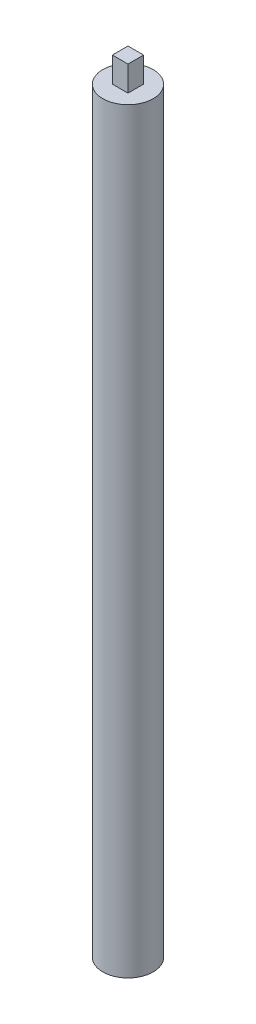
ISO-10303-21;
HEADER;
FILE_DESCRIPTION(('STEP AP214'),'2;1');
FILE_NAME('part.step','',(''),(''),'','','');
FILE_SCHEMA(('AUTOMOTIVE_DESIGN { 1 0 10303 214 1 1 1 1 }'));
ENDSEC;
DATA;
#1=APPLICATION_CONTEXT('core data for automotive mechanical design processes');
#2=APPLICATION_PROTOCOL_DEFINITION('international standard','automotive_design',2000,#1);
#3=PRODUCT_CONTEXT('',#1,'mechanical');
#4=PRODUCT('Part','Part','',(#3));
#5=PRODUCT_RELATED_PRODUCT_CATEGORY('part','',(#4));
#6=PRODUCT_DEFINITION_FORMATION('','',#4);
#7=PRODUCT_DEFINITION_CONTEXT('part definition',#1,'design');
#8=PRODUCT_DEFINITION('design','',#6,#7);
#9=PRODUCT_DEFINITION_SHAPE('','',#8);
#10=(LENGTH_UNIT() NAMED_UNIT(*) SI_UNIT(.MILLI.,.METRE.));
#11=(NAMED_UNIT(*) PLANE_ANGLE_UNIT() SI_UNIT($,.RADIAN.));
#12=(NAMED_UNIT(*) SI_UNIT($,.STERADIAN.) SOLID_ANGLE_UNIT());
#13=UNCERTAINTY_MEASURE_WITH_UNIT(LENGTH_MEASURE(1.E-05),#10,'distance_accuracy_value','');
#14=(GEOMETRIC_REPRESENTATION_CONTEXT(3) GLOBAL_UNCERTAINTY_ASSIGNED_CONTEXT((#13)) GLOBAL_UNIT_ASSIGNED_CONTEXT((#10,
#11,#12)) REPRESENTATION_CONTEXT('',''));
#15=CARTESIAN_POINT('',(0.,0.,0.));
#16=DIRECTION('',(0.,0.,1.));
#17=DIRECTION('',(1.,0.,0.));
#18=AXIS2_PLACEMENT_3D('',#15,#16,#17);
#19=CARTESIAN_POINT('',(0.,381.,0.));
#20=DIRECTION('',(0.,1.,0.));
#21=DIRECTION('',(0.,0.,1.));
#22=AXIS2_PLACEMENT_3D('',#19,#20,#21);
#23=PLANE('',#22);
#24=CARTESIAN_POINT('',(0.,381.,0.));
#25=DIRECTION('',(0.,1.,0.));
#26=DIRECTION('',(0.,0.,1.));
#27=AXIS2_PLACEMENT_3D('',#24,#25,#26);
#28=CIRCLE('',#27,12.7);
#29=CARTESIAN_POINT('',(0.,381.,12.7));
#30=VERTEX_POINT('',#29);
#31=EDGE_CURVE('E11',#30,#30,#28,.T.);
#32=ORIENTED_EDGE('',*,*,#31,.T.);
#33=EDGE_LOOP('',(#32));
#34=FACE_BOUND('',#33,.T.);
#35=DIRECTION('',(1.,0.,0.));
#36=VECTOR('',#35,1.);
#37=CARTESIAN_POINT('',(3.93683973800307,381.,3.9350245424572));
#38=LINE('',#37,#36);
#39=CARTESIAN_POINT('',(-3.93683973800307,381.,3.9350245424572));
#40=VERTEX_POINT('',#39);
#41=CARTESIAN_POINT('',(3.93683973800307,381.,3.9350245424572));
#42=VERTEX_POINT('',#41);
#43=EDGE_CURVE('E89',#40,#42,#38,.T.);
#44=ORIENTED_EDGE('',*,*,#43,.F.);
#45=DIRECTION('',(0.,0.,1.));
#46=VECTOR('',#45,1.);
#47=CARTESIAN_POINT('',(-3.93683973800307,381.,3.9350245424572));
#48=LINE('',#47,#46);
#49=CARTESIAN_POINT('',(-3.93683973800307,381.,-3.9350245424572));
#50=VERTEX_POINT('',#49);
#51=EDGE_CURVE('E100',#50,#40,#48,.T.);
#52=ORIENTED_EDGE('',*,*,#51,.F.);
#53=DIRECTION('',(-1.,0.,0.));
#54=VECTOR('',#53,1.);
#55=CARTESIAN_POINT('',(3.93683973800307,381.,-3.9350245424572));
#56=LINE('',#55,#54);
#57=CARTESIAN_POINT('',(3.93683973800307,381.,-3.9350245424572));
#58=VERTEX_POINT('',#57);
#59=EDGE_CURVE('E70',#58,#50,#56,.T.);
#60=ORIENTED_EDGE('',*,*,#59,.F.);
#61=DIRECTION('',(0.,0.,-1.));
#62=VECTOR('',#61,1.);
#63=CARTESIAN_POINT('',(3.93683973800307,381.,3.9350245424572));
#64=LINE('',#63,#62);
#65=EDGE_CURVE('E104',#42,#58,#64,.T.);
#66=ORIENTED_EDGE('',*,*,#65,.F.);
#67=EDGE_LOOP('',(#44,#52,#60,#66));
#68=FACE_BOUND('',#67,.T.);
#69=ADVANCED_FACE('F33',(#34,#68),#23,.T.);
#70=CARTESIAN_POINT('',(0.,381.,0.));
#71=DIRECTION('',(0.,-1.,0.));
#72=DIRECTION('',(0.,0.,-1.));
#73=AXIS2_PLACEMENT_3D('',#70,#71,#72);
#74=CYLINDRICAL_SURFACE('',#73,12.7);
#75=ORIENTED_EDGE('',*,*,#31,.F.);
#76=EDGE_LOOP('',(#75));
#77=FACE_BOUND('',#76,.T.);
#78=CARTESIAN_POINT('',(0.,0.,0.));
#79=DIRECTION('',(0.,1.,0.));
#80=DIRECTION('',(0.,0.,1.));
#81=AXIS2_PLACEMENT_3D('',#78,#79,#80);
#82=CIRCLE('',#81,12.7);
#83=CARTESIAN_POINT('',(0.,0.,12.7));
#84=VERTEX_POINT('',#83);
#85=EDGE_CURVE('E37',#84,#84,#82,.T.);
#86=ORIENTED_EDGE('',*,*,#85,.T.);
#87=EDGE_LOOP('',(#86));
#88=FACE_BOUND('',#87,.T.);
#89=ADVANCED_FACE('F35',(#77,#88),#74,.T.);
#90=CARTESIAN_POINT('',(0.,0.,0.));
#91=DIRECTION('',(0.,1.,0.));
#92=DIRECTION('',(0.,0.,1.));
#93=AXIS2_PLACEMENT_3D('',#90,#91,#92);
#94=PLANE('',#93);
#95=ORIENTED_EDGE('',*,*,#85,.F.);
#96=EDGE_LOOP('',(#95));
#97=FACE_BOUND('',#96,.T.);
#98=ADVANCED_FACE('F113',(#97),#94,.F.);
#99=CARTESIAN_POINT('',(-3.93683973800307,393.7,3.9350245424572));
#100=DIRECTION('',(1.,0.,0.));
#101=DIRECTION('',(0.,0.,-1.));
#102=AXIS2_PLACEMENT_3D('',#99,#100,#101);
#103=PLANE('',#102);
#104=ORIENTED_EDGE('',*,*,#51,.T.);
#105=DIRECTION('',(0.,-1.,0.));
#106=VECTOR('',#105,1.);
#107=CARTESIAN_POINT('',(-3.93683973800307,393.7,3.9350245424572));
#108=LINE('',#107,#106);
#109=CARTESIAN_POINT('',(-3.93683973800307,393.7,3.9350245424572));
#110=VERTEX_POINT('',#109);
#111=EDGE_CURVE('E92',#110,#40,#108,.T.);
#112=ORIENTED_EDGE('',*,*,#111,.F.);
#113=DIRECTION('',(0.,0.,1.));
#114=VECTOR('',#113,1.);
#115=CARTESIAN_POINT('',(-3.93683973800307,393.7,3.9350245424572));
#116=LINE('',#115,#114);
#117=CARTESIAN_POINT('',(-3.93683973800307,393.7,-3.9350245424572));
#118=VERTEX_POINT('',#117);
#119=EDGE_CURVE('E82',#118,#110,#116,.T.);
#120=ORIENTED_EDGE('',*,*,#119,.F.);
#121=DIRECTION('',(0.,-1.,0.));
#122=VECTOR('',#121,1.);
#123=CARTESIAN_POINT('',(-3.93683973800307,393.7,-3.9350245424572));
#124=LINE('',#123,#122);
#125=EDGE_CURVE('E96',#118,#50,#124,.T.);
#126=ORIENTED_EDGE('',*,*,#125,.T.);
#127=EDGE_LOOP('',(#104,#112,#120,#126));
#128=FACE_BOUND('',#127,.T.);
#129=ADVANCED_FACE('F115',(#128),#103,.F.);
#130=CARTESIAN_POINT('',(3.93683973800307,393.7,3.9350245424572));
#131=DIRECTION('',(0.,0.,-1.));
#132=DIRECTION('',(-1.,0.,0.));
#133=AXIS2_PLACEMENT_3D('',#130,#131,#132);
#134=PLANE('',#133);
#135=ORIENTED_EDGE('',*,*,#43,.T.);
#136=DIRECTION('',(0.,-1.,0.));
#137=VECTOR('',#136,1.);
#138=CARTESIAN_POINT('',(3.93683973800307,393.7,3.9350245424572));
#139=LINE('',#138,#137);
#140=CARTESIAN_POINT('',(3.93683973800307,393.7,3.9350245424572));
#141=VERTEX_POINT('',#140);
#142=EDGE_CURVE('E86',#141,#42,#139,.T.);
#143=ORIENTED_EDGE('',*,*,#142,.F.);
#144=DIRECTION('',(1.,0.,0.));
#145=VECTOR('',#144,1.);
#146=CARTESIAN_POINT('',(3.93683973800307,393.7,3.9350245424572));
#147=LINE('',#146,#145);
#148=EDGE_CURVE('E77',#110,#141,#147,.T.);
#149=ORIENTED_EDGE('',*,*,#148,.F.);
#150=ORIENTED_EDGE('',*,*,#111,.T.);
#151=EDGE_LOOP('',(#135,#143,#149,#150));
#152=FACE_BOUND('',#151,.T.);
#153=ADVANCED_FACE('F87',(#152),#134,.F.);
#154=CARTESIAN_POINT('',(3.93683973800307,393.7,3.9350245424572));
#155=DIRECTION('',(-1.,0.,0.));
#156=DIRECTION('',(0.,0.,1.));
#157=AXIS2_PLACEMENT_3D('',#154,#155,#156);
#158=PLANE('',#157);
#159=ORIENTED_EDGE('',*,*,#65,.T.);
#160=DIRECTION('',(0.,-1.,0.));
#161=VECTOR('',#160,1.);
#162=CARTESIAN_POINT('',(3.93683973800307,393.7,-3.9350245424572));
#163=LINE('',#162,#161);
#164=CARTESIAN_POINT('',(3.93683973800307,393.7,-3.9350245424572));
#165=VERTEX_POINT('',#164);
#166=EDGE_CURVE('E48',#165,#58,#163,.T.);
#167=ORIENTED_EDGE('',*,*,#166,.F.);
#168=DIRECTION('',(0.,0.,-1.));
#169=VECTOR('',#168,1.);
#170=CARTESIAN_POINT('',(3.93683973800307,393.7,3.9350245424572));
#171=LINE('',#170,#169);
#172=EDGE_CURVE('E80',#141,#165,#171,.T.);
#173=ORIENTED_EDGE('',*,*,#172,.F.);
#174=ORIENTED_EDGE('',*,*,#142,.T.);
#175=EDGE_LOOP('',(#159,#167,#173,#174));
#176=FACE_BOUND('',#175,.T.);
#177=ADVANCED_FACE('F94',(#176),#158,.F.);
#178=CARTESIAN_POINT('',(3.93683973800307,393.7,-3.9350245424572));
#179=DIRECTION('',(0.,0.,1.));
#180=DIRECTION('',(1.,0.,0.));
#181=AXIS2_PLACEMENT_3D('',#178,#179,#180);
#182=PLANE('',#181);
#183=ORIENTED_EDGE('',*,*,#59,.T.);
#184=ORIENTED_EDGE('',*,*,#125,.F.);
#185=DIRECTION('',(-1.,0.,0.));
#186=VECTOR('',#185,1.);
#187=CARTESIAN_POINT('',(3.93683973800307,393.7,-3.9350245424572));
#188=LINE('',#187,#186);
#189=EDGE_CURVE('E56',#165,#118,#188,.T.);
#190=ORIENTED_EDGE('',*,*,#189,.F.);
#191=ORIENTED_EDGE('',*,*,#166,.T.);
#192=EDGE_LOOP('',(#183,#184,#190,#191));
#193=FACE_BOUND('',#192,.T.);
#194=ADVANCED_FACE('F136',(#193),#182,.F.);
#195=CARTESIAN_POINT('',(0.,393.7,0.));
#196=DIRECTION('',(0.,1.,0.));
#197=DIRECTION('',(0.,0.,1.));
#198=AXIS2_PLACEMENT_3D('',#195,#196,#197);
#199=PLANE('',#198);
#200=ORIENTED_EDGE('',*,*,#119,.T.);
#201=ORIENTED_EDGE('',*,*,#148,.T.);
#202=ORIENTED_EDGE('',*,*,#172,.T.);
#203=ORIENTED_EDGE('',*,*,#189,.T.);
#204=EDGE_LOOP('',(#200,#201,#202,#203));
#205=FACE_BOUND('',#204,.T.);
#206=ADVANCED_FACE('F78',(#205),#199,.T.);
#207=CLOSED_SHELL('',(#69,#89,#98,#129,#153,#177,#194,#206));
#208=MANIFOLD_SOLID_BREP('B2',#207);
#209=ADVANCED_BREP_SHAPE_REPRESENTATION('',(#18,#208),#14);
#210=SHAPE_DEFINITION_REPRESENTATION(#9,#209);
ENDSEC;
END-ISO-10303-21;
